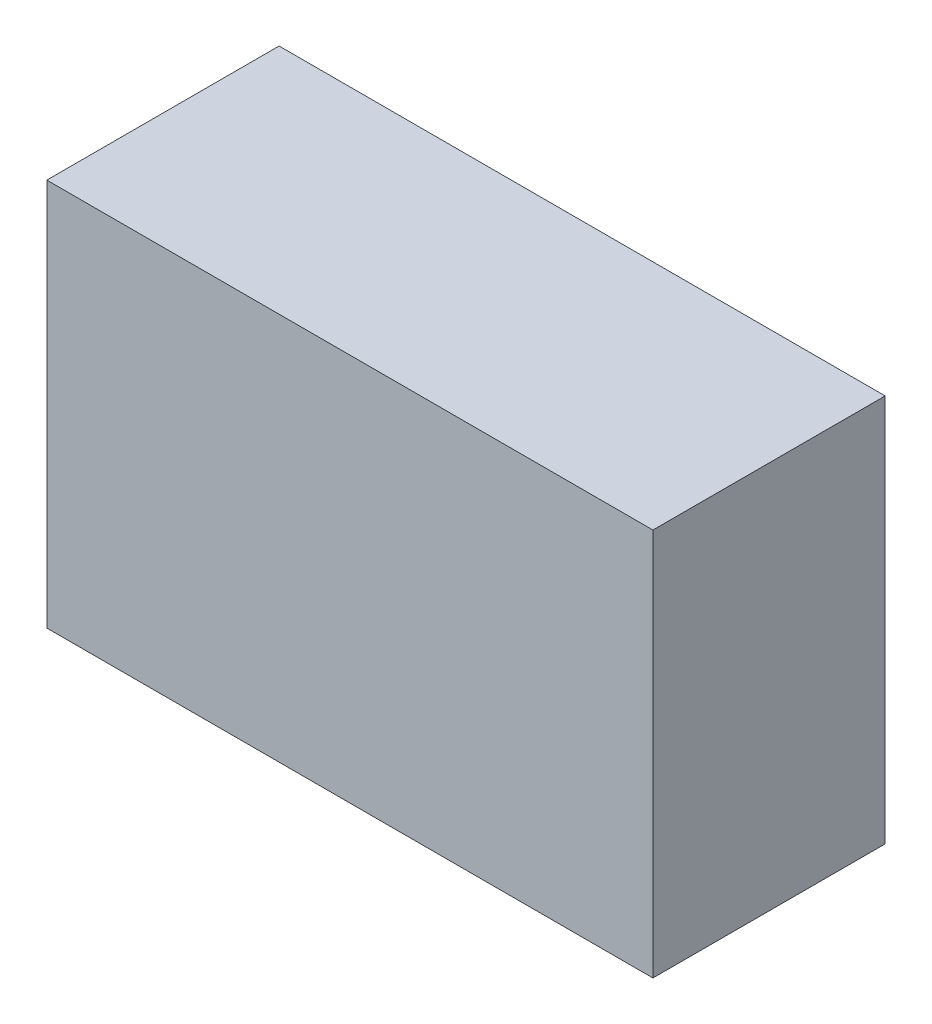
ISO-10303-21;
HEADER;
FILE_DESCRIPTION(('STEP AP214'),'2;1');
FILE_NAME('part.step','',(''),(''),'','','');
FILE_SCHEMA(('AUTOMOTIVE_DESIGN { 1 0 10303 214 1 1 1 1 }'));
ENDSEC;
DATA;
#1=APPLICATION_CONTEXT('core data for automotive mechanical design processes');
#2=APPLICATION_PROTOCOL_DEFINITION('international standard','automotive_design',2000,#1);
#3=PRODUCT_CONTEXT('',#1,'mechanical');
#4=PRODUCT('Part','Part','',(#3));
#5=PRODUCT_RELATED_PRODUCT_CATEGORY('part','',(#4));
#6=PRODUCT_DEFINITION_FORMATION('','',#4);
#7=PRODUCT_DEFINITION_CONTEXT('part definition',#1,'design');
#8=PRODUCT_DEFINITION('design','',#6,#7);
#9=PRODUCT_DEFINITION_SHAPE('','',#8);
#10=(LENGTH_UNIT() NAMED_UNIT(*) SI_UNIT(.MILLI.,.METRE.));
#11=(NAMED_UNIT(*) PLANE_ANGLE_UNIT() SI_UNIT($,.RADIAN.));
#12=(NAMED_UNIT(*) SI_UNIT($,.STERADIAN.) SOLID_ANGLE_UNIT());
#13=UNCERTAINTY_MEASURE_WITH_UNIT(LENGTH_MEASURE(1.E-05),#10,'distance_accuracy_value','');
#14=(GEOMETRIC_REPRESENTATION_CONTEXT(3) GLOBAL_UNCERTAINTY_ASSIGNED_CONTEXT((#13)) GLOBAL_UNIT_ASSIGNED_CONTEXT((#10,
#11,#12)) REPRESENTATION_CONTEXT('',''));
#15=CARTESIAN_POINT('',(0.,0.,0.));
#16=DIRECTION('',(0.,0.,1.));
#17=DIRECTION('',(1.,0.,0.));
#18=AXIS2_PLACEMENT_3D('',#15,#16,#17);
#19=CARTESIAN_POINT('',(69.1481957144099,-44.2628644170293,53.));
#20=DIRECTION('',(-1.,0.,0.));
#21=DIRECTION('',(0.,0.,1.));
#22=AXIS2_PLACEMENT_3D('',#19,#20,#21);
#23=PLANE('',#22);
#24=DIRECTION('',(0.,1.,0.));
#25=VECTOR('',#24,1.);
#26=CARTESIAN_POINT('',(69.1481957144099,-44.2628644170293,0.));
#27=LINE('',#26,#25);
#28=CARTESIAN_POINT('',(69.1481957144099,-44.2628644170293,0.));
#29=VERTEX_POINT('',#28);
#30=CARTESIAN_POINT('',(69.1481957144099,44.2628644170293,0.));
#31=VERTEX_POINT('',#30);
#32=EDGE_CURVE('E111',#29,#31,#27,.T.);
#33=ORIENTED_EDGE('',*,*,#32,.T.);
#34=DIRECTION('',(0.,0.,-1.));
#35=VECTOR('',#34,1.);
#36=CARTESIAN_POINT('',(69.1481957144099,44.2628644170293,53.));
#37=LINE('',#36,#35);
#38=CARTESIAN_POINT('',(69.1481957144099,44.2628644170293,53.));
#39=VERTEX_POINT('',#38);
#40=EDGE_CURVE('E11',#39,#31,#37,.T.);
#41=ORIENTED_EDGE('',*,*,#40,.F.);
#42=DIRECTION('',(0.,1.,0.));
#43=VECTOR('',#42,1.);
#44=CARTESIAN_POINT('',(69.1481957144099,-44.2628644170293,53.));
#45=LINE('',#44,#43);
#46=CARTESIAN_POINT('',(69.1481957144099,-44.2628644170293,53.));
#47=VERTEX_POINT('',#46);
#48=EDGE_CURVE('E95',#47,#39,#45,.T.);
#49=ORIENTED_EDGE('',*,*,#48,.F.);
#50=DIRECTION('',(0.,0.,-1.));
#51=VECTOR('',#50,1.);
#52=CARTESIAN_POINT('',(69.1481957144099,-44.2628644170293,53.));
#53=LINE('',#52,#51);
#54=EDGE_CURVE('E107',#47,#29,#53,.T.);
#55=ORIENTED_EDGE('',*,*,#54,.T.);
#56=EDGE_LOOP('',(#33,#41,#49,#55));
#57=FACE_BOUND('',#56,.T.);
#58=ADVANCED_FACE('F43',(#57),#23,.F.);
#59=CARTESIAN_POINT('',(-69.1481957144099,44.2628644170293,53.));
#60=DIRECTION('',(0.,-1.,0.));
#61=DIRECTION('',(0.,0.,-1.));
#62=AXIS2_PLACEMENT_3D('',#59,#60,#61);
#63=PLANE('',#62);
#64=DIRECTION('',(-1.,0.,0.));
#65=VECTOR('',#64,1.);
#66=CARTESIAN_POINT('',(-69.1481957144099,44.2628644170293,0.));
#67=LINE('',#66,#65);
#68=CARTESIAN_POINT('',(-69.1481957144099,44.2628644170293,0.));
#69=VERTEX_POINT('',#68);
#70=EDGE_CURVE('E100',#31,#69,#67,.T.);
#71=ORIENTED_EDGE('',*,*,#70,.T.);
#72=DIRECTION('',(0.,0.,-1.));
#73=VECTOR('',#72,1.);
#74=CARTESIAN_POINT('',(-69.1481957144099,44.2628644170293,53.));
#75=LINE('',#74,#73);
#76=CARTESIAN_POINT('',(-69.1481957144099,44.2628644170293,53.));
#77=VERTEX_POINT('',#76);
#78=EDGE_CURVE('E52',#77,#69,#75,.T.);
#79=ORIENTED_EDGE('',*,*,#78,.F.);
#80=DIRECTION('',(-1.,0.,0.));
#81=VECTOR('',#80,1.);
#82=CARTESIAN_POINT('',(-69.1481957144099,44.2628644170293,53.));
#83=LINE('',#82,#81);
#84=EDGE_CURVE('E90',#39,#77,#83,.T.);
#85=ORIENTED_EDGE('',*,*,#84,.F.);
#86=ORIENTED_EDGE('',*,*,#40,.T.);
#87=EDGE_LOOP('',(#71,#79,#85,#86));
#88=FACE_BOUND('',#87,.T.);
#89=ADVANCED_FACE('F99',(#88),#63,.F.);
#90=CARTESIAN_POINT('',(-69.1481957144099,-44.2628644170293,53.));
#91=DIRECTION('',(1.,0.,0.));
#92=DIRECTION('',(0.,0.,-1.));
#93=AXIS2_PLACEMENT_3D('',#90,#91,#92);
#94=PLANE('',#93);
#95=DIRECTION('',(0.,-1.,0.));
#96=VECTOR('',#95,1.);
#97=CARTESIAN_POINT('',(-69.1481957144099,-44.2628644170293,0.));
#98=LINE('',#97,#96);
#99=CARTESIAN_POINT('',(-69.1481957144099,-44.2628644170293,0.));
#100=VERTEX_POINT('',#99);
#101=EDGE_CURVE('E77',#69,#100,#98,.T.);
#102=ORIENTED_EDGE('',*,*,#101,.T.);
#103=DIRECTION('',(0.,0.,-1.));
#104=VECTOR('',#103,1.);
#105=CARTESIAN_POINT('',(-69.1481957144099,-44.2628644170293,53.));
#106=LINE('',#105,#104);
#107=CARTESIAN_POINT('',(-69.1481957144099,-44.2628644170293,53.));
#108=VERTEX_POINT('',#107);
#109=EDGE_CURVE('E102',#108,#100,#106,.T.);
#110=ORIENTED_EDGE('',*,*,#109,.F.);
#111=DIRECTION('',(0.,-1.,0.));
#112=VECTOR('',#111,1.);
#113=CARTESIAN_POINT('',(-69.1481957144099,-44.2628644170293,53.));
#114=LINE('',#113,#112);
#115=EDGE_CURVE('E93',#77,#108,#114,.T.);
#116=ORIENTED_EDGE('',*,*,#115,.F.);
#117=ORIENTED_EDGE('',*,*,#78,.T.);
#118=EDGE_LOOP('',(#102,#110,#116,#117));
#119=FACE_BOUND('',#118,.T.);
#120=ADVANCED_FACE('F103',(#119),#94,.F.);
#121=CARTESIAN_POINT('',(-69.1481957144099,-44.2628644170293,53.));
#122=DIRECTION('',(0.,1.,0.));
#123=DIRECTION('',(0.,0.,1.));
#124=AXIS2_PLACEMENT_3D('',#121,#122,#123);
#125=PLANE('',#124);
#126=DIRECTION('',(1.,0.,0.));
#127=VECTOR('',#126,1.);
#128=CARTESIAN_POINT('',(-69.1481957144099,-44.2628644170293,0.));
#129=LINE('',#128,#127);
#130=EDGE_CURVE('E83',#100,#29,#129,.T.);
#131=ORIENTED_EDGE('',*,*,#130,.T.);
#132=ORIENTED_EDGE('',*,*,#54,.F.);
#133=DIRECTION('',(1.,0.,0.));
#134=VECTOR('',#133,1.);
#135=CARTESIAN_POINT('',(-69.1481957144099,-44.2628644170293,53.));
#136=LINE('',#135,#134);
#137=EDGE_CURVE('E60',#108,#47,#136,.T.);
#138=ORIENTED_EDGE('',*,*,#137,.F.);
#139=ORIENTED_EDGE('',*,*,#109,.T.);
#140=EDGE_LOOP('',(#131,#132,#138,#139));
#141=FACE_BOUND('',#140,.T.);
#142=ADVANCED_FACE('F124',(#141),#125,.F.);
#143=CARTESIAN_POINT('',(0.,0.,53.));
#144=DIRECTION('',(0.,0.,-1.));
#145=DIRECTION('',(-1.,0.,0.));
#146=AXIS2_PLACEMENT_3D('',#143,#144,#145);
#147=PLANE('',#146);
#148=ORIENTED_EDGE('',*,*,#48,.T.);
#149=ORIENTED_EDGE('',*,*,#84,.T.);
#150=ORIENTED_EDGE('',*,*,#115,.T.);
#151=ORIENTED_EDGE('',*,*,#137,.T.);
#152=EDGE_LOOP('',(#148,#149,#150,#151));
#153=FACE_BOUND('',#152,.T.);
#154=ADVANCED_FACE('F91',(#153),#147,.F.);
#155=CARTESIAN_POINT('',(0.,0.,0.));
#156=DIRECTION('',(0.,0.,-1.));
#157=DIRECTION('',(-1.,0.,0.));
#158=AXIS2_PLACEMENT_3D('',#155,#156,#157);
#159=PLANE('',#158);
#160=ORIENTED_EDGE('',*,*,#32,.F.);
#161=ORIENTED_EDGE('',*,*,#130,.F.);
#162=ORIENTED_EDGE('',*,*,#101,.F.);
#163=ORIENTED_EDGE('',*,*,#70,.F.);
#164=EDGE_LOOP('',(#160,#161,#162,#163));
#165=FACE_BOUND('',#164,.T.);
#166=ADVANCED_FACE('F127',(#165),#159,.T.);
#167=CLOSED_SHELL('',(#58,#89,#120,#142,#154,#166));
#168=MANIFOLD_SOLID_BREP('B2',#167);
#169=ADVANCED_BREP_SHAPE_REPRESENTATION('',(#18,#168),#14);
#170=SHAPE_DEFINITION_REPRESENTATION(#9,#169);
ENDSEC;
END-ISO-10303-21;
